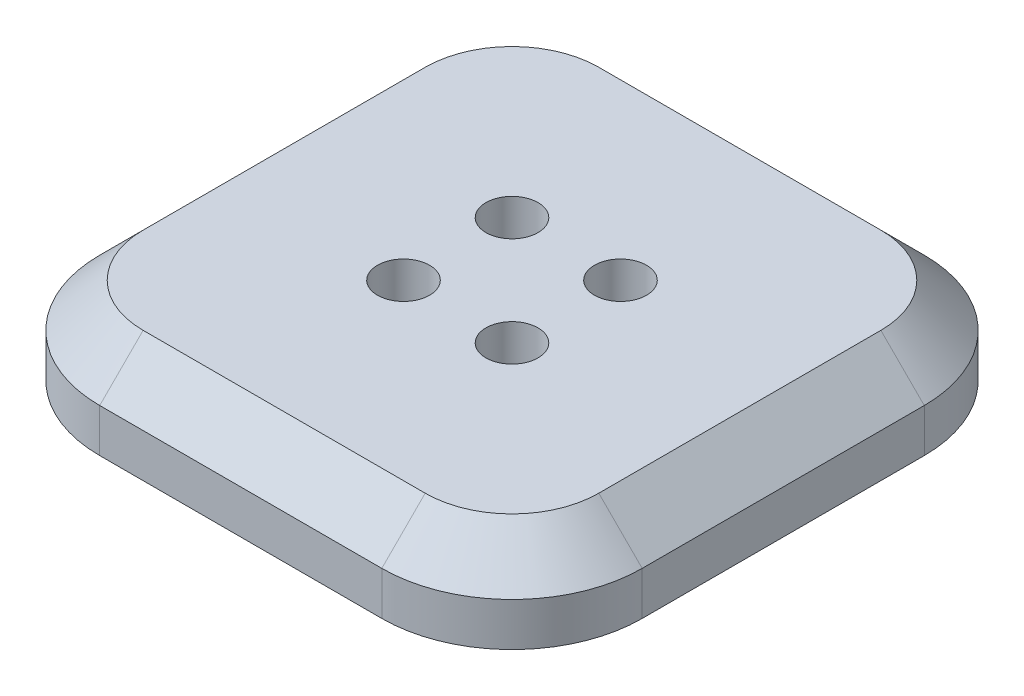
ISO-10303-21;
HEADER;
FILE_DESCRIPTION(('STEP AP214'),'2;1');
FILE_NAME('part.step','',(''),(''),'','','');
FILE_SCHEMA(('AUTOMOTIVE_DESIGN { 1 0 10303 214 1 1 1 1 }'));
ENDSEC;
DATA;
#1=APPLICATION_CONTEXT('core data for automotive mechanical design processes');
#2=APPLICATION_PROTOCOL_DEFINITION('international standard','automotive_design',2000,#1);
#3=PRODUCT_CONTEXT('',#1,'mechanical');
#4=PRODUCT('Part','Part','',(#3));
#5=PRODUCT_RELATED_PRODUCT_CATEGORY('part','',(#4));
#6=PRODUCT_DEFINITION_FORMATION('','',#4);
#7=PRODUCT_DEFINITION_CONTEXT('part definition',#1,'design');
#8=PRODUCT_DEFINITION('design','',#6,#7);
#9=PRODUCT_DEFINITION_SHAPE('','',#8);
#10=(LENGTH_UNIT() NAMED_UNIT(*) SI_UNIT(.MILLI.,.METRE.));
#11=(NAMED_UNIT(*) PLANE_ANGLE_UNIT() SI_UNIT($,.RADIAN.));
#12=(NAMED_UNIT(*) SI_UNIT($,.STERADIAN.) SOLID_ANGLE_UNIT());
#13=UNCERTAINTY_MEASURE_WITH_UNIT(LENGTH_MEASURE(1.E-05),#10,'distance_accuracy_value','');
#14=(GEOMETRIC_REPRESENTATION_CONTEXT(3) GLOBAL_UNCERTAINTY_ASSIGNED_CONTEXT((#13)) GLOBAL_UNIT_ASSIGNED_CONTEXT((#10,
#11,#12)) REPRESENTATION_CONTEXT('',''));
#15=CARTESIAN_POINT('',(0.,0.,0.));
#16=DIRECTION('',(0.,0.,1.));
#17=DIRECTION('',(1.,0.,0.));
#18=AXIS2_PLACEMENT_3D('',#15,#16,#17);
#19=CARTESIAN_POINT('',(-62.5,20.,62.5));
#20=DIRECTION('',(1.,0.,0.));
#21=DIRECTION('',(0.,0.,-1.));
#22=AXIS2_PLACEMENT_3D('',#19,#20,#21);
#23=PLANE('',#22);
#24=DIRECTION('',(0.,-1.,0.));
#25=VECTOR('',#24,1.);
#26=CARTESIAN_POINT('',(-62.5,20.,32.5));
#27=LINE('',#26,#25);
#28=CARTESIAN_POINT('',(-62.5,0.,32.5));
#29=VERTEX_POINT('',#28);
#30=CARTESIAN_POINT('',(-62.5,9.99999999999995,32.5));
#31=VERTEX_POINT('',#30);
#32=EDGE_CURVE('E240',#29,#31,#27,.F.);
#33=ORIENTED_EDGE('',*,*,#32,.T.);
#34=DIRECTION('',(0.,0.,-1.));
#35=VECTOR('',#34,1.);
#36=CARTESIAN_POINT('',(-62.5,9.99999999999995,62.5));
#37=LINE('',#36,#35);
#38=CARTESIAN_POINT('',(-62.5,9.99999999999995,-32.5));
#39=VERTEX_POINT('',#38);
#40=EDGE_CURVE('E42',#31,#39,#37,.T.);
#41=ORIENTED_EDGE('',*,*,#40,.T.);
#42=DIRECTION('',(0.,-1.,0.));
#43=VECTOR('',#42,1.);
#44=CARTESIAN_POINT('',(-62.5,20.,-32.5));
#45=LINE('',#44,#43);
#46=CARTESIAN_POINT('',(-62.5,0.,-32.5));
#47=VERTEX_POINT('',#46);
#48=EDGE_CURVE('E238',#39,#47,#45,.T.);
#49=ORIENTED_EDGE('',*,*,#48,.T.);
#50=DIRECTION('',(0.,0.,1.));
#51=VECTOR('',#50,1.);
#52=CARTESIAN_POINT('',(-62.5,0.,62.5));
#53=LINE('',#52,#51);
#54=EDGE_CURVE('E203',#47,#29,#53,.T.);
#55=ORIENTED_EDGE('',*,*,#54,.T.);
#56=EDGE_LOOP('',(#33,#41,#49,#55));
#57=FACE_BOUND('',#56,.T.);
#58=ADVANCED_FACE('F33',(#57),#23,.F.);
#59=CARTESIAN_POINT('',(62.5,20.,62.5));
#60=DIRECTION('',(0.,0.,-1.));
#61=DIRECTION('',(-1.,0.,0.));
#62=AXIS2_PLACEMENT_3D('',#59,#60,#61);
#63=PLANE('',#62);
#64=DIRECTION('',(0.,-1.,0.));
#65=VECTOR('',#64,1.);
#66=CARTESIAN_POINT('',(32.5,20.,62.5));
#67=LINE('',#66,#65);
#68=CARTESIAN_POINT('',(32.5,0.,62.5));
#69=VERTEX_POINT('',#68);
#70=CARTESIAN_POINT('',(32.5,9.99999999999995,62.5));
#71=VERTEX_POINT('',#70);
#72=EDGE_CURVE('E233',#69,#71,#67,.F.);
#73=ORIENTED_EDGE('',*,*,#72,.T.);
#74=DIRECTION('',(-1.,0.,0.));
#75=VECTOR('',#74,1.);
#76=CARTESIAN_POINT('',(62.5,9.99999999999995,62.5));
#77=LINE('',#76,#75);
#78=CARTESIAN_POINT('',(-32.5,9.99999999999995,62.5));
#79=VERTEX_POINT('',#78);
#80=EDGE_CURVE('E259',#71,#79,#77,.T.);
#81=ORIENTED_EDGE('',*,*,#80,.T.);
#82=DIRECTION('',(0.,-1.,0.));
#83=VECTOR('',#82,1.);
#84=CARTESIAN_POINT('',(-32.5,20.,62.5));
#85=LINE('',#84,#83);
#86=CARTESIAN_POINT('',(-32.5,0.,62.5));
#87=VERTEX_POINT('',#86);
#88=EDGE_CURVE('E236',#79,#87,#85,.T.);
#89=ORIENTED_EDGE('',*,*,#88,.T.);
#90=DIRECTION('',(1.,0.,0.));
#91=VECTOR('',#90,1.);
#92=CARTESIAN_POINT('',(62.5,0.,62.5));
#93=LINE('',#92,#91);
#94=EDGE_CURVE('E206',#87,#69,#93,.T.);
#95=ORIENTED_EDGE('',*,*,#94,.T.);
#96=EDGE_LOOP('',(#73,#81,#89,#95));
#97=FACE_BOUND('',#96,.T.);
#98=ADVANCED_FACE('F325',(#97),#63,.F.);
#99=CARTESIAN_POINT('',(62.5,20.,-62.5));
#100=DIRECTION('',(-1.,0.,0.));
#101=DIRECTION('',(0.,0.,1.));
#102=AXIS2_PLACEMENT_3D('',#99,#100,#101);
#103=PLANE('',#102);
#104=DIRECTION('',(0.,-1.,0.));
#105=VECTOR('',#104,1.);
#106=CARTESIAN_POINT('',(62.5,20.,-32.5));
#107=LINE('',#106,#105);
#108=CARTESIAN_POINT('',(62.5,0.,-32.5));
#109=VERTEX_POINT('',#108);
#110=CARTESIAN_POINT('',(62.5,9.99999999999995,-32.5));
#111=VERTEX_POINT('',#110);
#112=EDGE_CURVE('E230',#109,#111,#107,.F.);
#113=ORIENTED_EDGE('',*,*,#112,.T.);
#114=DIRECTION('',(0.,0.,1.));
#115=VECTOR('',#114,1.);
#116=CARTESIAN_POINT('',(62.5,9.99999999999995,-62.5));
#117=LINE('',#116,#115);
#118=CARTESIAN_POINT('',(62.5,9.99999999999995,32.5));
#119=VERTEX_POINT('',#118);
#120=EDGE_CURVE('E264',#111,#119,#117,.T.);
#121=ORIENTED_EDGE('',*,*,#120,.T.);
#122=DIRECTION('',(0.,-1.,0.));
#123=VECTOR('',#122,1.);
#124=CARTESIAN_POINT('',(62.5,20.,32.5));
#125=LINE('',#124,#123);
#126=CARTESIAN_POINT('',(62.5,0.,32.5));
#127=VERTEX_POINT('',#126);
#128=EDGE_CURVE('E228',#119,#127,#125,.T.);
#129=ORIENTED_EDGE('',*,*,#128,.T.);
#130=DIRECTION('',(0.,0.,-1.));
#131=VECTOR('',#130,1.);
#132=CARTESIAN_POINT('',(62.5,0.,-62.5));
#133=LINE('',#132,#131);
#134=EDGE_CURVE('E209',#127,#109,#133,.T.);
#135=ORIENTED_EDGE('',*,*,#134,.T.);
#136=EDGE_LOOP('',(#113,#121,#129,#135));
#137=FACE_BOUND('',#136,.T.);
#138=ADVANCED_FACE('F356',(#137),#103,.F.);
#139=CARTESIAN_POINT('',(-62.5,20.,-62.5));
#140=DIRECTION('',(0.,0.,1.));
#141=DIRECTION('',(1.,0.,0.));
#142=AXIS2_PLACEMENT_3D('',#139,#140,#141);
#143=PLANE('',#142);
#144=DIRECTION('',(0.,-1.,0.));
#145=VECTOR('',#144,1.);
#146=CARTESIAN_POINT('',(-32.5,20.,-62.5));
#147=LINE('',#146,#145);
#148=CARTESIAN_POINT('',(-32.5,0.,-62.5));
#149=VERTEX_POINT('',#148);
#150=CARTESIAN_POINT('',(-32.5,9.99999999999995,-62.5));
#151=VERTEX_POINT('',#150);
#152=EDGE_CURVE('E215',#149,#151,#147,.F.);
#153=ORIENTED_EDGE('',*,*,#152,.T.);
#154=DIRECTION('',(1.,0.,0.));
#155=VECTOR('',#154,1.);
#156=CARTESIAN_POINT('',(-62.5,9.99999999999995,-62.5));
#157=LINE('',#156,#155);
#158=CARTESIAN_POINT('',(32.5,9.99999999999995,-62.5));
#159=VERTEX_POINT('',#158);
#160=EDGE_CURVE('E268',#151,#159,#157,.T.);
#161=ORIENTED_EDGE('',*,*,#160,.T.);
#162=DIRECTION('',(0.,-1.,0.));
#163=VECTOR('',#162,1.);
#164=CARTESIAN_POINT('',(32.5,20.,-62.5));
#165=LINE('',#164,#163);
#166=CARTESIAN_POINT('',(32.5,0.,-62.5));
#167=VERTEX_POINT('',#166);
#168=EDGE_CURVE('E218',#159,#167,#165,.T.);
#169=ORIENTED_EDGE('',*,*,#168,.T.);
#170=DIRECTION('',(-1.,0.,0.));
#171=VECTOR('',#170,1.);
#172=CARTESIAN_POINT('',(-62.5,0.,-62.5));
#173=LINE('',#172,#171);
#174=EDGE_CURVE('E212',#167,#149,#173,.T.);
#175=ORIENTED_EDGE('',*,*,#174,.T.);
#176=EDGE_LOOP('',(#153,#161,#169,#175));
#177=FACE_BOUND('',#176,.T.);
#178=ADVANCED_FACE('F305',(#177),#143,.F.);
#179=CARTESIAN_POINT('',(0.,20.,0.));
#180=DIRECTION('',(0.,-1.,0.));
#181=DIRECTION('',(0.,0.,-1.));
#182=AXIS2_PLACEMENT_3D('',#179,#180,#181);
#183=PLANE('',#182);
#184=CARTESIAN_POINT('',(12.5,20.,-12.5));
#185=DIRECTION('',(0.,1.,0.));
#186=DIRECTION('',(0.,0.,1.));
#187=AXIS2_PLACEMENT_3D('',#184,#185,#186);
#188=CIRCLE('',#187,6.);
#189=CARTESIAN_POINT('',(12.5,20.,-6.5));
#190=VERTEX_POINT('',#189);
#191=EDGE_CURVE('E156',#190,#190,#188,.T.);
#192=ORIENTED_EDGE('',*,*,#191,.F.);
#193=EDGE_LOOP('',(#192));
#194=FACE_BOUND('',#193,.T.);
#195=CARTESIAN_POINT('',(12.5,20.,12.5));
#196=DIRECTION('',(0.,1.,0.));
#197=DIRECTION('',(0.,0.,1.));
#198=AXIS2_PLACEMENT_3D('',#195,#196,#197);
#199=CIRCLE('',#198,6.);
#200=CARTESIAN_POINT('',(12.5,20.,18.5));
#201=VERTEX_POINT('',#200);
#202=EDGE_CURVE('E155',#201,#201,#199,.T.);
#203=ORIENTED_EDGE('',*,*,#202,.F.);
#204=EDGE_LOOP('',(#203));
#205=FACE_BOUND('',#204,.T.);
#206=CARTESIAN_POINT('',(-12.5,20.,12.5));
#207=DIRECTION('',(0.,1.,0.));
#208=DIRECTION('',(0.,0.,1.));
#209=AXIS2_PLACEMENT_3D('',#206,#207,#208);
#210=CIRCLE('',#209,6.);
#211=CARTESIAN_POINT('',(-12.5,20.,18.5));
#212=VERTEX_POINT('',#211);
#213=EDGE_CURVE('E166',#212,#212,#210,.T.);
#214=ORIENTED_EDGE('',*,*,#213,.F.);
#215=EDGE_LOOP('',(#214));
#216=FACE_BOUND('',#215,.T.);
#217=CARTESIAN_POINT('',(-12.5,20.,-12.5));
#218=DIRECTION('',(0.,1.,0.));
#219=DIRECTION('',(0.,0.,1.));
#220=AXIS2_PLACEMENT_3D('',#217,#218,#219);
#221=CIRCLE('',#220,6.);
#222=CARTESIAN_POINT('',(-12.5,20.,-6.5));
#223=VERTEX_POINT('',#222);
#224=EDGE_CURVE('E172',#223,#223,#221,.T.);
#225=ORIENTED_EDGE('',*,*,#224,.F.);
#226=EDGE_LOOP('',(#225));
#227=FACE_BOUND('',#226,.T.);
#228=CARTESIAN_POINT('',(-32.5,20.,32.5));
#229=DIRECTION('',(0.,-1.,0.));
#230=DIRECTION('',(0.,0.,-1.));
#231=AXIS2_PLACEMENT_3D('',#228,#229,#230);
#232=CIRCLE('',#231,19.9999999999999);
#233=CARTESIAN_POINT('',(-52.4999999999999,20.,32.5));
#234=VERTEX_POINT('',#233);
#235=CARTESIAN_POINT('',(-32.5,20.,52.4999999999999));
#236=VERTEX_POINT('',#235);
#237=EDGE_CURVE('E242',#234,#236,#232,.F.);
#238=ORIENTED_EDGE('',*,*,#237,.T.);
#239=DIRECTION('',(1.,0.,0.));
#240=VECTOR('',#239,1.);
#241=CARTESIAN_POINT('',(0.,20.,52.4999999999999));
#242=LINE('',#241,#240);
#243=CARTESIAN_POINT('',(32.5,20.,52.4999999999999));
#244=VERTEX_POINT('',#243);
#245=EDGE_CURVE('E256',#236,#244,#242,.T.);
#246=ORIENTED_EDGE('',*,*,#245,.T.);
#247=CARTESIAN_POINT('',(32.5,20.,32.5));
#248=DIRECTION('',(0.,-1.,0.));
#249=DIRECTION('',(0.,0.,-1.));
#250=AXIS2_PLACEMENT_3D('',#247,#248,#249);
#251=CIRCLE('',#250,19.9999999999999);
#252=CARTESIAN_POINT('',(52.4999999999999,20.,32.5));
#253=VERTEX_POINT('',#252);
#254=EDGE_CURVE('E254',#244,#253,#251,.F.);
#255=ORIENTED_EDGE('',*,*,#254,.T.);
#256=DIRECTION('',(0.,0.,-1.));
#257=VECTOR('',#256,1.);
#258=CARTESIAN_POINT('',(52.4999999999999,20.,0.));
#259=LINE('',#258,#257);
#260=CARTESIAN_POINT('',(52.4999999999999,20.,-32.5));
#261=VERTEX_POINT('',#260);
#262=EDGE_CURVE('E252',#253,#261,#259,.T.);
#263=ORIENTED_EDGE('',*,*,#262,.T.);
#264=CARTESIAN_POINT('',(32.5,20.,-32.5));
#265=DIRECTION('',(0.,-1.,0.));
#266=DIRECTION('',(0.,0.,-1.));
#267=AXIS2_PLACEMENT_3D('',#264,#265,#266);
#268=CIRCLE('',#267,19.9999999999999);
#269=CARTESIAN_POINT('',(32.5,20.,-52.4999999999999));
#270=VERTEX_POINT('',#269);
#271=EDGE_CURVE('E250',#261,#270,#268,.F.);
#272=ORIENTED_EDGE('',*,*,#271,.T.);
#273=DIRECTION('',(-1.,0.,0.));
#274=VECTOR('',#273,1.);
#275=CARTESIAN_POINT('',(0.,20.,-52.4999999999999));
#276=LINE('',#275,#274);
#277=CARTESIAN_POINT('',(-32.5,20.,-52.4999999999999));
#278=VERTEX_POINT('',#277);
#279=EDGE_CURVE('E248',#270,#278,#276,.T.);
#280=ORIENTED_EDGE('',*,*,#279,.T.);
#281=CARTESIAN_POINT('',(-32.5,20.,-32.5));
#282=DIRECTION('',(0.,-1.,0.));
#283=DIRECTION('',(0.,0.,-1.));
#284=AXIS2_PLACEMENT_3D('',#281,#282,#283);
#285=CIRCLE('',#284,19.9999999999999);
#286=CARTESIAN_POINT('',(-52.4999999999999,20.,-32.5));
#287=VERTEX_POINT('',#286);
#288=EDGE_CURVE('E246',#278,#287,#285,.F.);
#289=ORIENTED_EDGE('',*,*,#288,.T.);
#290=DIRECTION('',(0.,0.,1.));
#291=VECTOR('',#290,1.);
#292=CARTESIAN_POINT('',(-52.4999999999999,20.,0.));
#293=LINE('',#292,#291);
#294=EDGE_CURVE('E244',#287,#234,#293,.T.);
#295=ORIENTED_EDGE('',*,*,#294,.T.);
#296=EDGE_LOOP('',(#238,#246,#255,#263,#272,#280,#289,#295));
#297=FACE_BOUND('',#296,.T.);
#298=ADVANCED_FACE('F348',(#194,#205,#216,#227,#297),#183,.F.);
#299=CARTESIAN_POINT('',(0.,0.,0.));
#300=DIRECTION('',(0.,-1.,0.));
#301=DIRECTION('',(0.,0.,-1.));
#302=AXIS2_PLACEMENT_3D('',#299,#300,#301);
#303=PLANE('',#302);
#304=CARTESIAN_POINT('',(37.5,0.,37.5));
#305=DIRECTION('',(0.,-1.,0.));
#306=DIRECTION('',(0.,0.,-1.));
#307=AXIS2_PLACEMENT_3D('',#304,#305,#306);
#308=CIRCLE('',#307,6.);
#309=CARTESIAN_POINT('',(37.5,0.,31.5));
#310=VERTEX_POINT('',#309);
#311=EDGE_CURVE('E178',#310,#310,#308,.T.);
#312=ORIENTED_EDGE('',*,*,#311,.F.);
#313=EDGE_LOOP('',(#312));
#314=FACE_BOUND('',#313,.T.);
#315=CARTESIAN_POINT('',(-37.5,0.,37.5));
#316=DIRECTION('',(0.,-1.,0.));
#317=DIRECTION('',(0.,0.,-1.));
#318=AXIS2_PLACEMENT_3D('',#315,#316,#317);
#319=CIRCLE('',#318,6.);
#320=CARTESIAN_POINT('',(-37.5,0.,31.5));
#321=VERTEX_POINT('',#320);
#322=EDGE_CURVE('E184',#321,#321,#319,.T.);
#323=ORIENTED_EDGE('',*,*,#322,.F.);
#324=EDGE_LOOP('',(#323));
#325=FACE_BOUND('',#324,.T.);
#326=CARTESIAN_POINT('',(-37.5,0.,-37.5));
#327=DIRECTION('',(0.,-1.,0.));
#328=DIRECTION('',(0.,0.,-1.));
#329=AXIS2_PLACEMENT_3D('',#326,#327,#328);
#330=CIRCLE('',#329,6.);
#331=CARTESIAN_POINT('',(-37.5,0.,-43.5));
#332=VERTEX_POINT('',#331);
#333=EDGE_CURVE('E190',#332,#332,#330,.T.);
#334=ORIENTED_EDGE('',*,*,#333,.F.);
#335=EDGE_LOOP('',(#334));
#336=FACE_BOUND('',#335,.T.);
#337=CARTESIAN_POINT('',(37.5,0.,-37.5));
#338=DIRECTION('',(0.,-1.,0.));
#339=DIRECTION('',(0.,0.,-1.));
#340=AXIS2_PLACEMENT_3D('',#337,#338,#339);
#341=CIRCLE('',#340,6.);
#342=CARTESIAN_POINT('',(37.5,0.,-43.5));
#343=VERTEX_POINT('',#342);
#344=EDGE_CURVE('E196',#343,#343,#341,.T.);
#345=ORIENTED_EDGE('',*,*,#344,.F.);
#346=EDGE_LOOP('',(#345));
#347=FACE_BOUND('',#346,.T.);
#348=ORIENTED_EDGE('',*,*,#174,.F.);
#349=CARTESIAN_POINT('',(32.5,0.,-32.5));
#350=DIRECTION('',(0.,-1.,0.));
#351=DIRECTION('',(0.,0.,-1.));
#352=AXIS2_PLACEMENT_3D('',#349,#350,#351);
#353=CIRCLE('',#352,30.);
#354=EDGE_CURVE('E226',#167,#109,#353,.T.);
#355=ORIENTED_EDGE('',*,*,#354,.T.);
#356=ORIENTED_EDGE('',*,*,#134,.F.);
#357=CARTESIAN_POINT('',(32.5,0.,32.5));
#358=DIRECTION('',(0.,-1.,0.));
#359=DIRECTION('',(0.,0.,-1.));
#360=AXIS2_PLACEMENT_3D('',#357,#358,#359);
#361=CIRCLE('',#360,30.);
#362=EDGE_CURVE('E220',#127,#69,#361,.T.);
#363=ORIENTED_EDGE('',*,*,#362,.T.);
#364=ORIENTED_EDGE('',*,*,#94,.F.);
#365=CARTESIAN_POINT('',(-32.5,0.,32.5));
#366=DIRECTION('',(0.,-1.,0.));
#367=DIRECTION('',(0.,0.,-1.));
#368=AXIS2_PLACEMENT_3D('',#365,#366,#367);
#369=CIRCLE('',#368,30.);
#370=EDGE_CURVE('E224',#87,#29,#369,.T.);
#371=ORIENTED_EDGE('',*,*,#370,.T.);
#372=ORIENTED_EDGE('',*,*,#54,.F.);
#373=CARTESIAN_POINT('',(-32.5,0.,-32.5));
#374=DIRECTION('',(0.,-1.,0.));
#375=DIRECTION('',(0.,0.,-1.));
#376=AXIS2_PLACEMENT_3D('',#373,#374,#375);
#377=CIRCLE('',#376,30.);
#378=EDGE_CURVE('E222',#47,#149,#377,.T.);
#379=ORIENTED_EDGE('',*,*,#378,.T.);
#380=EDGE_LOOP('',(#348,#355,#356,#363,#364,#371,#372,#379));
#381=FACE_BOUND('',#380,.T.);
#382=ADVANCED_FACE('F314',(#314,#325,#336,#347,#381),#303,.T.);
#383=CARTESIAN_POINT('',(32.5,20.,-32.5));
#384=DIRECTION('',(0.,-1.,0.));
#385=DIRECTION('',(0.,0.,-1.));
#386=AXIS2_PLACEMENT_3D('',#383,#384,#385);
#387=CYLINDRICAL_SURFACE('',#386,30.);
#388=ORIENTED_EDGE('',*,*,#168,.F.);
#389=CARTESIAN_POINT('',(32.5,9.99999999999995,-32.5));
#390=DIRECTION('',(0.,-1.,0.));
#391=DIRECTION('',(0.,0.,-1.));
#392=AXIS2_PLACEMENT_3D('',#389,#390,#391);
#393=CIRCLE('',#392,30.);
#394=EDGE_CURVE('E266',#159,#111,#393,.T.);
#395=ORIENTED_EDGE('',*,*,#394,.T.);
#396=ORIENTED_EDGE('',*,*,#112,.F.);
#397=ORIENTED_EDGE('',*,*,#354,.F.);
#398=EDGE_LOOP('',(#388,#395,#396,#397));
#399=FACE_BOUND('',#398,.T.);
#400=ADVANCED_FACE('F309',(#399),#387,.T.);
#401=CARTESIAN_POINT('',(-32.5,20.,32.5));
#402=DIRECTION('',(0.,-1.,0.));
#403=DIRECTION('',(0.,0.,-1.));
#404=AXIS2_PLACEMENT_3D('',#401,#402,#403);
#405=CYLINDRICAL_SURFACE('',#404,30.);
#406=ORIENTED_EDGE('',*,*,#88,.F.);
#407=CARTESIAN_POINT('',(-32.5,9.99999999999995,32.5));
#408=DIRECTION('',(0.,-1.,0.));
#409=DIRECTION('',(0.,0.,-1.));
#410=AXIS2_PLACEMENT_3D('',#407,#408,#409);
#411=CIRCLE('',#410,30.);
#412=EDGE_CURVE('E11',#79,#31,#411,.T.);
#413=ORIENTED_EDGE('',*,*,#412,.T.);
#414=ORIENTED_EDGE('',*,*,#32,.F.);
#415=ORIENTED_EDGE('',*,*,#370,.F.);
#416=EDGE_LOOP('',(#406,#413,#414,#415));
#417=FACE_BOUND('',#416,.T.);
#418=ADVANCED_FACE('F320',(#417),#405,.T.);
#419=CARTESIAN_POINT('',(-32.5,20.,-32.5));
#420=DIRECTION('',(0.,-1.,0.));
#421=DIRECTION('',(0.,0.,-1.));
#422=AXIS2_PLACEMENT_3D('',#419,#420,#421);
#423=CYLINDRICAL_SURFACE('',#422,30.);
#424=ORIENTED_EDGE('',*,*,#48,.F.);
#425=CARTESIAN_POINT('',(-32.5,9.99999999999995,-32.5));
#426=DIRECTION('',(0.,-1.,0.));
#427=DIRECTION('',(0.,0.,-1.));
#428=AXIS2_PLACEMENT_3D('',#425,#426,#427);
#429=CIRCLE('',#428,30.);
#430=EDGE_CURVE('E270',#39,#151,#429,.T.);
#431=ORIENTED_EDGE('',*,*,#430,.T.);
#432=ORIENTED_EDGE('',*,*,#152,.F.);
#433=ORIENTED_EDGE('',*,*,#378,.F.);
#434=EDGE_LOOP('',(#424,#431,#432,#433));
#435=FACE_BOUND('',#434,.T.);
#436=ADVANCED_FACE('F318',(#435),#423,.T.);
#437=CARTESIAN_POINT('',(32.5,20.,32.5));
#438=DIRECTION('',(0.,-1.,0.));
#439=DIRECTION('',(0.,0.,-1.));
#440=AXIS2_PLACEMENT_3D('',#437,#438,#439);
#441=CYLINDRICAL_SURFACE('',#440,30.);
#442=ORIENTED_EDGE('',*,*,#128,.F.);
#443=CARTESIAN_POINT('',(32.5,9.99999999999995,32.5));
#444=DIRECTION('',(0.,-1.,0.));
#445=DIRECTION('',(0.,0.,-1.));
#446=AXIS2_PLACEMENT_3D('',#443,#444,#445);
#447=CIRCLE('',#446,30.);
#448=EDGE_CURVE('E262',#119,#71,#447,.T.);
#449=ORIENTED_EDGE('',*,*,#448,.T.);
#450=ORIENTED_EDGE('',*,*,#72,.F.);
#451=ORIENTED_EDGE('',*,*,#362,.F.);
#452=EDGE_LOOP('',(#442,#449,#450,#451));
#453=FACE_BOUND('',#452,.T.);
#454=ADVANCED_FACE('F329',(#453),#441,.T.);
#455=CARTESIAN_POINT('',(0.,20.,-52.4999999999999));
#456=DIRECTION('',(0.,-0.707106781186548,0.707106781186546));
#457=DIRECTION('',(-1.,0.,0.));
#458=AXIS2_PLACEMENT_3D('',#455,#456,#457);
#459=PLANE('',#458);
#460=DIRECTION('',(0.,0.707106781186546,0.707106781186548));
#461=VECTOR('',#460,1.);
#462=CARTESIAN_POINT('',(32.5,9.99999999999995,-62.5));
#463=LINE('',#462,#461);
#464=EDGE_CURVE('E287',#159,#270,#463,.T.);
#465=ORIENTED_EDGE('',*,*,#464,.F.);
#466=ORIENTED_EDGE('',*,*,#160,.F.);
#467=DIRECTION('',(0.,-0.707106781186546,-0.707106781186548));
#468=VECTOR('',#467,1.);
#469=CARTESIAN_POINT('',(-32.5,20.,-52.4999999999999));
#470=LINE('',#469,#468);
#471=EDGE_CURVE('E37',#278,#151,#470,.T.);
#472=ORIENTED_EDGE('',*,*,#471,.F.);
#473=ORIENTED_EDGE('',*,*,#279,.F.);
#474=EDGE_LOOP('',(#465,#466,#472,#473));
#475=FACE_BOUND('',#474,.T.);
#476=ADVANCED_FACE('F35',(#475),#459,.F.);
#477=CARTESIAN_POINT('',(-32.5,20.,-32.5));
#478=DIRECTION('',(0.,-1.,0.));
#479=DIRECTION('',(0.,0.,-1.));
#480=AXIS2_PLACEMENT_3D('',#477,#478,#479);
#481=CONICAL_SURFACE('',#480,19.9999999999999,0.78539816339745);
#482=ORIENTED_EDGE('',*,*,#471,.T.);
#483=ORIENTED_EDGE('',*,*,#430,.F.);
#484=DIRECTION('',(-0.707106781186548,-0.707106781186547,0.));
#485=VECTOR('',#484,1.);
#486=CARTESIAN_POINT('',(-52.4999999999999,20.,-32.5));
#487=LINE('',#486,#485);
#488=EDGE_CURVE('E285',#287,#39,#487,.T.);
#489=ORIENTED_EDGE('',*,*,#488,.F.);
#490=ORIENTED_EDGE('',*,*,#288,.F.);
#491=EDGE_LOOP('',(#482,#483,#489,#490));
#492=FACE_BOUND('',#491,.T.);
#493=ADVANCED_FACE('F298',(#492),#481,.T.);
#494=CARTESIAN_POINT('',(32.5,20.,-32.5));
#495=DIRECTION('',(0.,-1.,0.));
#496=DIRECTION('',(0.,0.,-1.));
#497=AXIS2_PLACEMENT_3D('',#494,#495,#496);
#498=CONICAL_SURFACE('',#497,19.9999999999999,0.78539816339745);
#499=ORIENTED_EDGE('',*,*,#464,.T.);
#500=ORIENTED_EDGE('',*,*,#271,.F.);
#501=DIRECTION('',(-0.707106781186548,0.707106781186547,0.));
#502=VECTOR('',#501,1.);
#503=CARTESIAN_POINT('',(62.5,9.99999999999995,-32.5));
#504=LINE('',#503,#502);
#505=EDGE_CURVE('E282',#111,#261,#504,.T.);
#506=ORIENTED_EDGE('',*,*,#505,.F.);
#507=ORIENTED_EDGE('',*,*,#394,.F.);
#508=EDGE_LOOP('',(#499,#500,#506,#507));
#509=FACE_BOUND('',#508,.T.);
#510=ADVANCED_FACE('F351',(#509),#498,.T.);
#511=CARTESIAN_POINT('',(-52.4999999999999,20.,0.));
#512=DIRECTION('',(0.707106781186546,-0.707106781186548,0.));
#513=DIRECTION('',(0.,0.,1.));
#514=AXIS2_PLACEMENT_3D('',#511,#512,#513);
#515=PLANE('',#514);
#516=ORIENTED_EDGE('',*,*,#488,.T.);
#517=ORIENTED_EDGE('',*,*,#40,.F.);
#518=DIRECTION('',(-0.707106781186548,-0.707106781186546,0.));
#519=VECTOR('',#518,1.);
#520=CARTESIAN_POINT('',(-52.4999999999999,20.,32.5));
#521=LINE('',#520,#519);
#522=EDGE_CURVE('E279',#234,#31,#521,.T.);
#523=ORIENTED_EDGE('',*,*,#522,.F.);
#524=ORIENTED_EDGE('',*,*,#294,.F.);
#525=EDGE_LOOP('',(#516,#517,#523,#524));
#526=FACE_BOUND('',#525,.T.);
#527=ADVANCED_FACE('F346',(#526),#515,.F.);
#528=CARTESIAN_POINT('',(52.4999999999999,20.,0.));
#529=DIRECTION('',(-0.707106781186546,-0.707106781186548,0.));
#530=DIRECTION('',(0.,0.,-1.));
#531=AXIS2_PLACEMENT_3D('',#528,#529,#530);
#532=PLANE('',#531);
#533=ORIENTED_EDGE('',*,*,#505,.T.);
#534=ORIENTED_EDGE('',*,*,#262,.F.);
#535=DIRECTION('',(-0.707106781186548,0.707106781186546,0.));
#536=VECTOR('',#535,1.);
#537=CARTESIAN_POINT('',(62.5,9.99999999999995,32.5));
#538=LINE('',#537,#536);
#539=EDGE_CURVE('E276',#119,#253,#538,.T.);
#540=ORIENTED_EDGE('',*,*,#539,.F.);
#541=ORIENTED_EDGE('',*,*,#120,.F.);
#542=EDGE_LOOP('',(#533,#534,#540,#541));
#543=FACE_BOUND('',#542,.T.);
#544=ADVANCED_FACE('F354',(#543),#532,.F.);
#545=CARTESIAN_POINT('',(-32.5,20.,32.5));
#546=DIRECTION('',(0.,-1.,0.));
#547=DIRECTION('',(0.,0.,-1.));
#548=AXIS2_PLACEMENT_3D('',#545,#546,#547);
#549=CONICAL_SURFACE('',#548,19.9999999999999,0.78539816339745);
#550=ORIENTED_EDGE('',*,*,#522,.T.);
#551=ORIENTED_EDGE('',*,*,#412,.F.);
#552=DIRECTION('',(0.,-0.707106781186547,0.707106781186548));
#553=VECTOR('',#552,1.);
#554=CARTESIAN_POINT('',(-32.5,20.,52.4999999999999));
#555=LINE('',#554,#553);
#556=EDGE_CURVE('E274',#236,#79,#555,.T.);
#557=ORIENTED_EDGE('',*,*,#556,.F.);
#558=ORIENTED_EDGE('',*,*,#237,.F.);
#559=EDGE_LOOP('',(#550,#551,#557,#558));
#560=FACE_BOUND('',#559,.T.);
#561=ADVANCED_FACE('F342',(#560),#549,.T.);
#562=CARTESIAN_POINT('',(32.5,20.,32.5));
#563=DIRECTION('',(0.,-1.,0.));
#564=DIRECTION('',(0.,0.,-1.));
#565=AXIS2_PLACEMENT_3D('',#562,#563,#564);
#566=CONICAL_SURFACE('',#565,19.9999999999999,0.78539816339745);
#567=ORIENTED_EDGE('',*,*,#539,.T.);
#568=ORIENTED_EDGE('',*,*,#254,.F.);
#569=DIRECTION('',(0.,0.707106781186547,-0.707106781186548));
#570=VECTOR('',#569,1.);
#571=CARTESIAN_POINT('',(32.5,9.99999999999995,62.5));
#572=LINE('',#571,#570);
#573=EDGE_CURVE('E202',#71,#244,#572,.T.);
#574=ORIENTED_EDGE('',*,*,#573,.F.);
#575=ORIENTED_EDGE('',*,*,#448,.F.);
#576=EDGE_LOOP('',(#567,#568,#574,#575));
#577=FACE_BOUND('',#576,.T.);
#578=ADVANCED_FACE('F334',(#577),#566,.T.);
#579=CARTESIAN_POINT('',(0.,20.,52.4999999999999));
#580=DIRECTION('',(0.,-0.707106781186548,-0.707106781186546));
#581=DIRECTION('',(1.,0.,0.));
#582=AXIS2_PLACEMENT_3D('',#579,#580,#581);
#583=PLANE('',#582);
#584=ORIENTED_EDGE('',*,*,#556,.T.);
#585=ORIENTED_EDGE('',*,*,#80,.F.);
#586=ORIENTED_EDGE('',*,*,#573,.T.);
#587=ORIENTED_EDGE('',*,*,#245,.F.);
#588=EDGE_LOOP('',(#584,#585,#586,#587));
#589=FACE_BOUND('',#588,.T.);
#590=ADVANCED_FACE('F338',(#589),#583,.F.);
#591=CARTESIAN_POINT('',(37.5,9.99999999999999,-37.5));
#592=DIRECTION('',(0.,-1.,0.));
#593=DIRECTION('',(0.,0.,-1.));
#594=AXIS2_PLACEMENT_3D('',#591,#592,#593);
#595=CONICAL_SURFACE('',#594,6.,1.02974425867665);
#596=CARTESIAN_POINT('',(37.5,13.6051637141654,-37.5));
#597=VERTEX_POINT('',#596);
#598=VERTEX_LOOP('',#597);
#599=FACE_BOUND('',#598,.T.);
#600=CARTESIAN_POINT('',(37.5,9.99999999999999,-37.5));
#601=DIRECTION('',(0.,-1.,0.));
#602=DIRECTION('',(0.,0.,-1.));
#603=AXIS2_PLACEMENT_3D('',#600,#601,#602);
#604=CIRCLE('',#603,6.);
#605=CARTESIAN_POINT('',(37.5,9.99999999999999,-43.5));
#606=VERTEX_POINT('',#605);
#607=EDGE_CURVE('E199',#606,#606,#604,.T.);
#608=ORIENTED_EDGE('',*,*,#607,.T.);
#609=EDGE_LOOP('',(#608));
#610=FACE_BOUND('',#609,.T.);
#611=ADVANCED_FACE('F380',(#599,#610),#595,.F.);
#612=CARTESIAN_POINT('',(37.5,0.,-37.5));
#613=DIRECTION('',(0.,-1.,0.));
#614=DIRECTION('',(0.,0.,-1.));
#615=AXIS2_PLACEMENT_3D('',#612,#613,#614);
#616=CYLINDRICAL_SURFACE('',#615,6.);
#617=ORIENTED_EDGE('',*,*,#607,.F.);
#618=EDGE_LOOP('',(#617));
#619=FACE_BOUND('',#618,.T.);
#620=ORIENTED_EDGE('',*,*,#344,.T.);
#621=EDGE_LOOP('',(#620));
#622=FACE_BOUND('',#621,.T.);
#623=ADVANCED_FACE('F504',(#619,#622),#616,.F.);
#624=CARTESIAN_POINT('',(-37.5,9.99999999999999,-37.5));
#625=DIRECTION('',(0.,-1.,0.));
#626=DIRECTION('',(0.,0.,-1.));
#627=AXIS2_PLACEMENT_3D('',#624,#625,#626);
#628=CONICAL_SURFACE('',#627,6.,1.02974425867665);
#629=CARTESIAN_POINT('',(-37.5,13.6051637141654,-37.5));
#630=VERTEX_POINT('',#629);
#631=VERTEX_LOOP('',#630);
#632=FACE_BOUND('',#631,.T.);
#633=CARTESIAN_POINT('',(-37.5,9.99999999999999,-37.5));
#634=DIRECTION('',(0.,-1.,0.));
#635=DIRECTION('',(0.,0.,-1.));
#636=AXIS2_PLACEMENT_3D('',#633,#634,#635);
#637=CIRCLE('',#636,6.);
#638=CARTESIAN_POINT('',(-37.5,9.99999999999999,-43.5));
#639=VERTEX_POINT('',#638);
#640=EDGE_CURVE('E193',#639,#639,#637,.T.);
#641=ORIENTED_EDGE('',*,*,#640,.T.);
#642=EDGE_LOOP('',(#641));
#643=FACE_BOUND('',#642,.T.);
#644=ADVANCED_FACE('F513',(#632,#643),#628,.F.);
#645=CARTESIAN_POINT('',(-37.5,0.,-37.5));
#646=DIRECTION('',(0.,-1.,0.));
#647=DIRECTION('',(0.,0.,-1.));
#648=AXIS2_PLACEMENT_3D('',#645,#646,#647);
#649=CYLINDRICAL_SURFACE('',#648,6.);
#650=ORIENTED_EDGE('',*,*,#640,.F.);
#651=EDGE_LOOP('',(#650));
#652=FACE_BOUND('',#651,.T.);
#653=ORIENTED_EDGE('',*,*,#333,.T.);
#654=EDGE_LOOP('',(#653));
#655=FACE_BOUND('',#654,.T.);
#656=ADVANCED_FACE('F522',(#652,#655),#649,.F.);
#657=CARTESIAN_POINT('',(-37.5,9.99999999999999,37.5));
#658=DIRECTION('',(0.,-1.,0.));
#659=DIRECTION('',(0.,0.,-1.));
#660=AXIS2_PLACEMENT_3D('',#657,#658,#659);
#661=CONICAL_SURFACE('',#660,6.,1.02974425867665);
#662=CARTESIAN_POINT('',(-37.5,13.6051637141654,37.5));
#663=VERTEX_POINT('',#662);
#664=VERTEX_LOOP('',#663);
#665=FACE_BOUND('',#664,.T.);
#666=CARTESIAN_POINT('',(-37.5,9.99999999999999,37.5));
#667=DIRECTION('',(0.,-1.,0.));
#668=DIRECTION('',(0.,0.,-1.));
#669=AXIS2_PLACEMENT_3D('',#666,#667,#668);
#670=CIRCLE('',#669,6.);
#671=CARTESIAN_POINT('',(-37.5,9.99999999999999,31.5));
#672=VERTEX_POINT('',#671);
#673=EDGE_CURVE('E187',#672,#672,#670,.T.);
#674=ORIENTED_EDGE('',*,*,#673,.T.);
#675=EDGE_LOOP('',(#674));
#676=FACE_BOUND('',#675,.T.);
#677=ADVANCED_FACE('F531',(#665,#676),#661,.F.);
#678=CARTESIAN_POINT('',(-37.5,0.,37.5));
#679=DIRECTION('',(0.,-1.,0.));
#680=DIRECTION('',(0.,0.,-1.));
#681=AXIS2_PLACEMENT_3D('',#678,#679,#680);
#682=CYLINDRICAL_SURFACE('',#681,6.);
#683=ORIENTED_EDGE('',*,*,#673,.F.);
#684=EDGE_LOOP('',(#683));
#685=FACE_BOUND('',#684,.T.);
#686=ORIENTED_EDGE('',*,*,#322,.T.);
#687=EDGE_LOOP('',(#686));
#688=FACE_BOUND('',#687,.T.);
#689=ADVANCED_FACE('F540',(#685,#688),#682,.F.);
#690=CARTESIAN_POINT('',(37.5,9.99999999999999,37.5));
#691=DIRECTION('',(0.,-1.,0.));
#692=DIRECTION('',(0.,0.,-1.));
#693=AXIS2_PLACEMENT_3D('',#690,#691,#692);
#694=CONICAL_SURFACE('',#693,6.,1.02974425867665);
#695=CARTESIAN_POINT('',(37.5,13.6051637141654,37.5));
#696=VERTEX_POINT('',#695);
#697=VERTEX_LOOP('',#696);
#698=FACE_BOUND('',#697,.T.);
#699=CARTESIAN_POINT('',(37.5,9.99999999999999,37.5));
#700=DIRECTION('',(0.,-1.,0.));
#701=DIRECTION('',(0.,0.,-1.));
#702=AXIS2_PLACEMENT_3D('',#699,#700,#701);
#703=CIRCLE('',#702,6.);
#704=CARTESIAN_POINT('',(37.5,9.99999999999999,31.5));
#705=VERTEX_POINT('',#704);
#706=EDGE_CURVE('E181',#705,#705,#703,.T.);
#707=ORIENTED_EDGE('',*,*,#706,.T.);
#708=EDGE_LOOP('',(#707));
#709=FACE_BOUND('',#708,.T.);
#710=ADVANCED_FACE('F549',(#698,#709),#694,.F.);
#711=CARTESIAN_POINT('',(37.5,0.,37.5));
#712=DIRECTION('',(0.,-1.,0.));
#713=DIRECTION('',(0.,0.,-1.));
#714=AXIS2_PLACEMENT_3D('',#711,#712,#713);
#715=CYLINDRICAL_SURFACE('',#714,6.);
#716=ORIENTED_EDGE('',*,*,#706,.F.);
#717=EDGE_LOOP('',(#716));
#718=FACE_BOUND('',#717,.T.);
#719=ORIENTED_EDGE('',*,*,#311,.T.);
#720=EDGE_LOOP('',(#719));
#721=FACE_BOUND('',#720,.T.);
#722=ADVANCED_FACE('F558',(#718,#721),#715,.F.);
#723=CARTESIAN_POINT('',(-12.5,10.,-12.5));
#724=DIRECTION('',(0.,1.,0.));
#725=DIRECTION('',(0.,0.,1.));
#726=AXIS2_PLACEMENT_3D('',#723,#724,#725);
#727=CONICAL_SURFACE('',#726,6.,1.02974425867665);
#728=CARTESIAN_POINT('',(-12.5,6.39483628583465,-12.5));
#729=VERTEX_POINT('',#728);
#730=VERTEX_LOOP('',#729);
#731=FACE_BOUND('',#730,.T.);
#732=CARTESIAN_POINT('',(-12.5,10.,-12.5));
#733=DIRECTION('',(0.,1.,0.));
#734=DIRECTION('',(0.,0.,1.));
#735=AXIS2_PLACEMENT_3D('',#732,#733,#734);
#736=CIRCLE('',#735,6.);
#737=CARTESIAN_POINT('',(-12.5,10.,-6.5));
#738=VERTEX_POINT('',#737);
#739=EDGE_CURVE('E175',#738,#738,#736,.T.);
#740=ORIENTED_EDGE('',*,*,#739,.T.);
#741=EDGE_LOOP('',(#740));
#742=FACE_BOUND('',#741,.T.);
#743=ADVANCED_FACE('F566',(#731,#742),#727,.F.);
#744=CARTESIAN_POINT('',(-12.5,20.,-12.5));
#745=DIRECTION('',(0.,1.,0.));
#746=DIRECTION('',(0.,0.,1.));
#747=AXIS2_PLACEMENT_3D('',#744,#745,#746);
#748=CYLINDRICAL_SURFACE('',#747,6.);
#749=ORIENTED_EDGE('',*,*,#739,.F.);
#750=EDGE_LOOP('',(#749));
#751=FACE_BOUND('',#750,.T.);
#752=ORIENTED_EDGE('',*,*,#224,.T.);
#753=EDGE_LOOP('',(#752));
#754=FACE_BOUND('',#753,.T.);
#755=ADVANCED_FACE('F574',(#751,#754),#748,.F.);
#756=CARTESIAN_POINT('',(-12.5,10.,12.5));
#757=DIRECTION('',(0.,1.,0.));
#758=DIRECTION('',(0.,0.,1.));
#759=AXIS2_PLACEMENT_3D('',#756,#757,#758);
#760=CONICAL_SURFACE('',#759,6.,1.02974425867665);
#761=CARTESIAN_POINT('',(-12.5,6.39483628583465,12.5));
#762=VERTEX_POINT('',#761);
#763=VERTEX_LOOP('',#762);
#764=FACE_BOUND('',#763,.T.);
#765=CARTESIAN_POINT('',(-12.5,10.,12.5));
#766=DIRECTION('',(0.,1.,0.));
#767=DIRECTION('',(0.,0.,1.));
#768=AXIS2_PLACEMENT_3D('',#765,#766,#767);
#769=CIRCLE('',#768,6.);
#770=CARTESIAN_POINT('',(-12.5,10.,18.5));
#771=VERTEX_POINT('',#770);
#772=EDGE_CURVE('E169',#771,#771,#769,.T.);
#773=ORIENTED_EDGE('',*,*,#772,.T.);
#774=EDGE_LOOP('',(#773));
#775=FACE_BOUND('',#774,.T.);
#776=ADVANCED_FACE('F583',(#764,#775),#760,.F.);
#777=CARTESIAN_POINT('',(-12.5,20.,12.5));
#778=DIRECTION('',(0.,1.,0.));
#779=DIRECTION('',(0.,0.,1.));
#780=AXIS2_PLACEMENT_3D('',#777,#778,#779);
#781=CYLINDRICAL_SURFACE('',#780,6.);
#782=ORIENTED_EDGE('',*,*,#772,.F.);
#783=EDGE_LOOP('',(#782));
#784=FACE_BOUND('',#783,.T.);
#785=ORIENTED_EDGE('',*,*,#213,.T.);
#786=EDGE_LOOP('',(#785));
#787=FACE_BOUND('',#786,.T.);
#788=ADVANCED_FACE('F592',(#784,#787),#781,.F.);
#789=CARTESIAN_POINT('',(12.5,10.,12.5));
#790=DIRECTION('',(0.,1.,0.));
#791=DIRECTION('',(0.,0.,1.));
#792=AXIS2_PLACEMENT_3D('',#789,#790,#791);
#793=CONICAL_SURFACE('',#792,6.,1.02974425867665);
#794=CARTESIAN_POINT('',(12.5,6.39483628583465,12.5));
#795=VERTEX_POINT('',#794);
#796=VERTEX_LOOP('',#795);
#797=FACE_BOUND('',#796,.T.);
#798=CARTESIAN_POINT('',(12.5,10.,12.5));
#799=DIRECTION('',(0.,1.,0.));
#800=DIRECTION('',(0.,0.,1.));
#801=AXIS2_PLACEMENT_3D('',#798,#799,#800);
#802=CIRCLE('',#801,6.);
#803=CARTESIAN_POINT('',(12.5,10.,18.5));
#804=VERTEX_POINT('',#803);
#805=EDGE_CURVE('E159',#804,#804,#802,.T.);
#806=ORIENTED_EDGE('',*,*,#805,.T.);
#807=EDGE_LOOP('',(#806));
#808=FACE_BOUND('',#807,.T.);
#809=ADVANCED_FACE('F601',(#797,#808),#793,.F.);
#810=CARTESIAN_POINT('',(12.5,20.,12.5));
#811=DIRECTION('',(0.,1.,0.));
#812=DIRECTION('',(0.,0.,1.));
#813=AXIS2_PLACEMENT_3D('',#810,#811,#812);
#814=CYLINDRICAL_SURFACE('',#813,6.);
#815=ORIENTED_EDGE('',*,*,#805,.F.);
#816=EDGE_LOOP('',(#815));
#817=FACE_BOUND('',#816,.T.);
#818=ORIENTED_EDGE('',*,*,#202,.T.);
#819=EDGE_LOOP('',(#818));
#820=FACE_BOUND('',#819,.T.);
#821=ADVANCED_FACE('F149',(#817,#820),#814,.F.);
#822=CARTESIAN_POINT('',(12.5,10.,-12.5));
#823=DIRECTION('',(0.,1.,0.));
#824=DIRECTION('',(0.,0.,1.));
#825=AXIS2_PLACEMENT_3D('',#822,#823,#824);
#826=CONICAL_SURFACE('',#825,6.,1.02974425867665);
#827=CARTESIAN_POINT('',(12.5,6.39483628583465,-12.5));
#828=VERTEX_POINT('',#827);
#829=VERTEX_LOOP('',#828);
#830=FACE_BOUND('',#829,.T.);
#831=CARTESIAN_POINT('',(12.5,10.,-12.5));
#832=DIRECTION('',(0.,1.,0.));
#833=DIRECTION('',(0.,0.,1.));
#834=AXIS2_PLACEMENT_3D('',#831,#832,#833);
#835=CIRCLE('',#834,6.);
#836=CARTESIAN_POINT('',(12.5,10.,-6.5));
#837=VERTEX_POINT('',#836);
#838=EDGE_CURVE('E153',#837,#837,#835,.T.);
#839=ORIENTED_EDGE('',*,*,#838,.T.);
#840=EDGE_LOOP('',(#839));
#841=FACE_BOUND('',#840,.T.);
#842=ADVANCED_FACE('F145',(#830,#841),#826,.F.);
#843=CARTESIAN_POINT('',(12.5,20.,-12.5));
#844=DIRECTION('',(0.,1.,0.));
#845=DIRECTION('',(0.,0.,1.));
#846=AXIS2_PLACEMENT_3D('',#843,#844,#845);
#847=CYLINDRICAL_SURFACE('',#846,6.);
#848=ORIENTED_EDGE('',*,*,#838,.F.);
#849=EDGE_LOOP('',(#848));
#850=FACE_BOUND('',#849,.T.);
#851=ORIENTED_EDGE('',*,*,#191,.T.);
#852=EDGE_LOOP('',(#851));
#853=FACE_BOUND('',#852,.T.);
#854=ADVANCED_FACE('F148',(#850,#853),#847,.F.);
#855=CLOSED_SHELL('',(#58,#98,#138,#178,#298,#382,#400,#418,#436,#454,#476,#493,#510,#527,#544,
#561,#578,#590,#611,#623,#644,#656,#677,#689,#710,#722,#743,#755,#776,#788,#809,#821,#842,#854));
#856=MANIFOLD_SOLID_BREP('B2',#855);
#857=ADVANCED_BREP_SHAPE_REPRESENTATION('',(#18,#856),#14);
#858=SHAPE_DEFINITION_REPRESENTATION(#9,#857);
ENDSEC;
END-ISO-10303-21;
